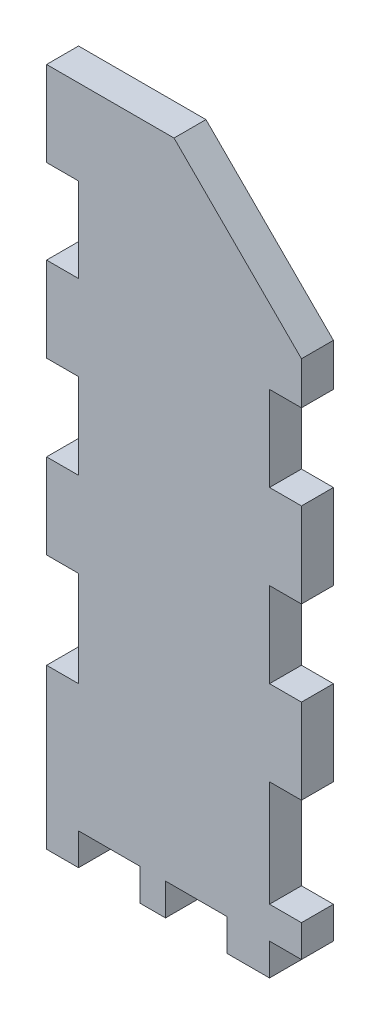
ISO-10303-21;
HEADER;
FILE_DESCRIPTION(('STEP AP214'),'2;1');
FILE_NAME('part.step','',(''),(''),'','','');
FILE_SCHEMA(('AUTOMOTIVE_DESIGN { 1 0 10303 214 1 1 1 1 }'));
ENDSEC;
DATA;
#1=APPLICATION_CONTEXT('core data for automotive mechanical design processes');
#2=APPLICATION_PROTOCOL_DEFINITION('international standard','automotive_design',2000,#1);
#3=PRODUCT_CONTEXT('',#1,'mechanical');
#4=PRODUCT('Part','Part','',(#3));
#5=PRODUCT_RELATED_PRODUCT_CATEGORY('part','',(#4));
#6=PRODUCT_DEFINITION_FORMATION('','',#4);
#7=PRODUCT_DEFINITION_CONTEXT('part definition',#1,'design');
#8=PRODUCT_DEFINITION('design','',#6,#7);
#9=PRODUCT_DEFINITION_SHAPE('','',#8);
#10=(LENGTH_UNIT() NAMED_UNIT(*) SI_UNIT(.MILLI.,.METRE.));
#11=(NAMED_UNIT(*) PLANE_ANGLE_UNIT() SI_UNIT($,.RADIAN.));
#12=(NAMED_UNIT(*) SI_UNIT($,.STERADIAN.) SOLID_ANGLE_UNIT());
#13=UNCERTAINTY_MEASURE_WITH_UNIT(LENGTH_MEASURE(1.E-05),#10,'distance_accuracy_value','');
#14=(GEOMETRIC_REPRESENTATION_CONTEXT(3) GLOBAL_UNCERTAINTY_ASSIGNED_CONTEXT((#13)) GLOBAL_UNIT_ASSIGNED_CONTEXT((#10,
#11,#12)) REPRESENTATION_CONTEXT('',''));
#15=CARTESIAN_POINT('',(0.,0.,0.));
#16=DIRECTION('',(0.,0.,1.));
#17=DIRECTION('',(1.,0.,0.));
#18=AXIS2_PLACEMENT_3D('',#15,#16,#17);
#19=CARTESIAN_POINT('',(38.1,0.,4.7752));
#20=DIRECTION('',(-1.,0.,0.));
#21=DIRECTION('',(0.,0.,1.));
#22=AXIS2_PLACEMENT_3D('',#19,#20,#21);
#23=PLANE('',#22);
#24=DIRECTION('',(0.,1.,0.));
#25=VECTOR('',#24,1.);
#26=CARTESIAN_POINT('',(38.1,0.,0.));
#27=LINE('',#26,#25);
#28=CARTESIAN_POINT('',(38.1,25.4,0.));
#29=VERTEX_POINT('',#28);
#30=CARTESIAN_POINT('',(38.1,38.1,0.));
#31=VERTEX_POINT('',#30);
#32=EDGE_CURVE('E566',#29,#31,#27,.T.);
#33=ORIENTED_EDGE('',*,*,#32,.T.);
#34=DIRECTION('',(0.,0.,1.));
#35=VECTOR('',#34,1.);
#36=CARTESIAN_POINT('',(38.1,38.1,-1.5748));
#37=LINE('',#36,#35);
#38=CARTESIAN_POINT('',(38.1,38.1,4.7752));
#39=VERTEX_POINT('',#38);
#40=EDGE_CURVE('E490',#31,#39,#37,.T.);
#41=ORIENTED_EDGE('',*,*,#40,.T.);
#42=DIRECTION('',(0.,1.,0.));
#43=VECTOR('',#42,1.);
#44=CARTESIAN_POINT('',(38.1,0.,4.7752));
#45=LINE('',#44,#43);
#46=CARTESIAN_POINT('',(38.1,25.4,4.7752));
#47=VERTEX_POINT('',#46);
#48=EDGE_CURVE('E330',#47,#39,#45,.T.);
#49=ORIENTED_EDGE('',*,*,#48,.F.);
#50=DIRECTION('',(0.,0.,1.));
#51=VECTOR('',#50,1.);
#52=CARTESIAN_POINT('',(38.1,25.4,-1.5748));
#53=LINE('',#52,#51);
#54=EDGE_CURVE('E309',#29,#47,#53,.T.);
#55=ORIENTED_EDGE('',*,*,#54,.F.);
#56=EDGE_LOOP('',(#33,#41,#49,#55));
#57=FACE_BOUND('',#56,.T.);
#58=ADVANCED_FACE('F45',(#57),#23,.F.);
#59=CARTESIAN_POINT('',(38.1,4.7752,0.));
#60=VERTEX_POINT('',#59);
#61=CARTESIAN_POINT('',(38.1,9.5504,0.));
#62=VERTEX_POINT('',#61);
#63=EDGE_CURVE('E318',#60,#62,#27,.T.);
#64=ORIENTED_EDGE('',*,*,#63,.T.);
#65=DIRECTION('',(0.,0.,1.));
#66=VECTOR('',#65,1.);
#67=CARTESIAN_POINT('',(38.1,9.5504,-1.5748));
#68=LINE('',#67,#66);
#69=CARTESIAN_POINT('',(38.1,9.5504,4.7752));
#70=VERTEX_POINT('',#69);
#71=EDGE_CURVE('E299',#62,#70,#68,.T.);
#72=ORIENTED_EDGE('',*,*,#71,.T.);
#73=CARTESIAN_POINT('',(38.1,4.7752,4.7752));
#74=VERTEX_POINT('',#73);
#75=EDGE_CURVE('E316',#74,#70,#45,.T.);
#76=ORIENTED_EDGE('',*,*,#75,.F.);
#77=DIRECTION('',(0.,0.,1.));
#78=VECTOR('',#77,1.);
#79=CARTESIAN_POINT('',(38.1,4.7752,-1.5748));
#80=LINE('',#79,#78);
#81=EDGE_CURVE('E368',#60,#74,#80,.T.);
#82=ORIENTED_EDGE('',*,*,#81,.F.);
#83=EDGE_LOOP('',(#64,#72,#76,#82));
#84=FACE_BOUND('',#83,.T.);
#85=ADVANCED_FACE('F314',(#84),#23,.F.);
#86=CARTESIAN_POINT('',(38.1,50.8,4.7752));
#87=VERTEX_POINT('',#86);
#88=CARTESIAN_POINT('',(38.1,63.5,4.7752));
#89=VERTEX_POINT('',#88);
#90=EDGE_CURVE('E340',#87,#89,#45,.T.);
#91=ORIENTED_EDGE('',*,*,#90,.F.);
#92=DIRECTION('',(0.,0.,1.));
#93=VECTOR('',#92,1.);
#94=CARTESIAN_POINT('',(38.1,50.8,-1.5748));
#95=LINE('',#94,#93);
#96=CARTESIAN_POINT('',(38.1,50.8,0.));
#97=VERTEX_POINT('',#96);
#98=EDGE_CURVE('E514',#97,#87,#95,.T.);
#99=ORIENTED_EDGE('',*,*,#98,.F.);
#100=CARTESIAN_POINT('',(38.1,63.5,0.));
#101=VERTEX_POINT('',#100);
#102=EDGE_CURVE('E780',#97,#101,#27,.T.);
#103=ORIENTED_EDGE('',*,*,#102,.T.);
#104=DIRECTION('',(0.,0.,1.));
#105=VECTOR('',#104,1.);
#106=CARTESIAN_POINT('',(38.1,63.5,-1.5748));
#107=LINE('',#106,#105);
#108=EDGE_CURVE('E472',#101,#89,#107,.T.);
#109=ORIENTED_EDGE('',*,*,#108,.T.);
#110=EDGE_LOOP('',(#91,#99,#103,#109));
#111=FACE_BOUND('',#110,.T.);
#112=ADVANCED_FACE('F753',(#111),#23,.F.);
#113=CARTESIAN_POINT('',(0.,0.,4.7752));
#114=DIRECTION('',(-1.,0.,0.));
#115=DIRECTION('',(0.,0.,1.));
#116=AXIS2_PLACEMENT_3D('',#113,#114,#115);
#117=PLANE('',#116);
#118=DIRECTION('',(0.,0.,-1.));
#119=VECTOR('',#118,1.);
#120=CARTESIAN_POINT('',(0.,88.9,4.7752));
#121=LINE('',#120,#119);
#122=CARTESIAN_POINT('',(0.,88.9,4.7752));
#123=VERTEX_POINT('',#122);
#124=CARTESIAN_POINT('',(0.,88.9,0.));
#125=VERTEX_POINT('',#124);
#126=EDGE_CURVE('E612',#123,#125,#121,.T.);
#127=ORIENTED_EDGE('',*,*,#126,.F.);
#128=DIRECTION('',(0.,1.,0.));
#129=VECTOR('',#128,1.);
#130=CARTESIAN_POINT('',(0.,0.,4.7752));
#131=LINE('',#130,#129);
#132=CARTESIAN_POINT('',(0.,101.6,4.7752));
#133=VERTEX_POINT('',#132);
#134=EDGE_CURVE('E694',#123,#133,#131,.T.);
#135=ORIENTED_EDGE('',*,*,#134,.T.);
#136=DIRECTION('',(0.,0.,-1.));
#137=VECTOR('',#136,1.);
#138=CARTESIAN_POINT('',(0.,101.6,4.7752));
#139=LINE('',#138,#137);
#140=CARTESIAN_POINT('',(0.,101.6,0.));
#141=VERTEX_POINT('',#140);
#142=EDGE_CURVE('E656',#133,#141,#139,.T.);
#143=ORIENTED_EDGE('',*,*,#142,.T.);
#144=DIRECTION('',(0.,1.,0.));
#145=VECTOR('',#144,1.);
#146=CARTESIAN_POINT('',(0.,0.,0.));
#147=LINE('',#146,#145);
#148=EDGE_CURVE('E674',#125,#141,#147,.T.);
#149=ORIENTED_EDGE('',*,*,#148,.F.);
#150=EDGE_LOOP('',(#127,#135,#143,#149));
#151=FACE_BOUND('',#150,.T.);
#152=ADVANCED_FACE('F763',(#151),#117,.T.);
#153=DIRECTION('',(0.,0.,-1.));
#154=VECTOR('',#153,1.);
#155=CARTESIAN_POINT('',(0.,38.1,4.7752));
#156=LINE('',#155,#154);
#157=CARTESIAN_POINT('',(0.,38.1,4.7752));
#158=VERTEX_POINT('',#157);
#159=CARTESIAN_POINT('',(0.,38.1,0.));
#160=VERTEX_POINT('',#159);
#161=EDGE_CURVE('E618',#158,#160,#156,.T.);
#162=ORIENTED_EDGE('',*,*,#161,.F.);
#163=CARTESIAN_POINT('',(0.,50.8,4.7752));
#164=VERTEX_POINT('',#163);
#165=EDGE_CURVE('E693',#158,#164,#131,.T.);
#166=ORIENTED_EDGE('',*,*,#165,.T.);
#167=DIRECTION('',(0.,0.,1.));
#168=VECTOR('',#167,1.);
#169=CARTESIAN_POINT('',(0.,50.8,4.7752));
#170=LINE('',#169,#168);
#171=CARTESIAN_POINT('',(0.,50.8,0.));
#172=VERTEX_POINT('',#171);
#173=EDGE_CURVE('E627',#172,#164,#170,.T.);
#174=ORIENTED_EDGE('',*,*,#173,.F.);
#175=EDGE_CURVE('E673',#160,#172,#147,.T.);
#176=ORIENTED_EDGE('',*,*,#175,.F.);
#177=EDGE_LOOP('',(#162,#166,#174,#176));
#178=FACE_BOUND('',#177,.T.);
#179=ADVANCED_FACE('F768',(#178),#117,.T.);
#180=DIRECTION('',(0.,0.,1.));
#181=VECTOR('',#180,1.);
#182=CARTESIAN_POINT('',(0.,76.2749723350131,4.7752));
#183=LINE('',#182,#181);
#184=CARTESIAN_POINT('',(0.,76.2749723350131,0.));
#185=VERTEX_POINT('',#184);
#186=CARTESIAN_POINT('',(0.,76.2749723350131,4.7752));
#187=VERTEX_POINT('',#186);
#188=EDGE_CURVE('E615',#185,#187,#183,.T.);
#189=ORIENTED_EDGE('',*,*,#188,.F.);
#190=CARTESIAN_POINT('',(0.,63.5749723350131,0.));
#191=VERTEX_POINT('',#190);
#192=EDGE_CURVE('E830',#191,#185,#147,.T.);
#193=ORIENTED_EDGE('',*,*,#192,.F.);
#194=DIRECTION('',(0.,0.,-1.));
#195=VECTOR('',#194,1.);
#196=CARTESIAN_POINT('',(0.,63.5749723350131,4.7752));
#197=LINE('',#196,#195);
#198=CARTESIAN_POINT('',(0.,63.5749723350131,4.7752));
#199=VERTEX_POINT('',#198);
#200=EDGE_CURVE('E624',#199,#191,#197,.T.);
#201=ORIENTED_EDGE('',*,*,#200,.F.);
#202=EDGE_CURVE('E701',#199,#187,#131,.T.);
#203=ORIENTED_EDGE('',*,*,#202,.T.);
#204=EDGE_LOOP('',(#189,#193,#201,#203));
#205=FACE_BOUND('',#204,.T.);
#206=ADVANCED_FACE('F811',(#205),#117,.T.);
#207=CARTESIAN_POINT('',(0.,0.,4.7752));
#208=DIRECTION('',(0.,1.,0.));
#209=DIRECTION('',(0.,0.,1.));
#210=AXIS2_PLACEMENT_3D('',#207,#208,#209);
#211=PLANE('',#210);
#212=DIRECTION('',(0.,0.,1.));
#213=VECTOR('',#212,1.);
#214=CARTESIAN_POINT('',(4.7752,0.,-1.5748));
#215=LINE('',#214,#213);
#216=CARTESIAN_POINT('',(4.7752,0.,0.));
#217=VERTEX_POINT('',#216);
#218=CARTESIAN_POINT('',(4.7752,0.,4.7752));
#219=VERTEX_POINT('',#218);
#220=EDGE_CURVE('E405',#217,#219,#215,.T.);
#221=ORIENTED_EDGE('',*,*,#220,.T.);
#222=DIRECTION('',(1.,0.,0.));
#223=VECTOR('',#222,1.);
#224=CARTESIAN_POINT('',(0.,0.,4.7752));
#225=LINE('',#224,#223);
#226=CARTESIAN_POINT('',(0.,0.,4.7752));
#227=VERTEX_POINT('',#226);
#228=EDGE_CURVE('E338',#227,#219,#225,.T.);
#229=ORIENTED_EDGE('',*,*,#228,.F.);
#230=DIRECTION('',(0.,0.,-1.));
#231=VECTOR('',#230,1.);
#232=CARTESIAN_POINT('',(0.,0.,4.7752));
#233=LINE('',#232,#231);
#234=CARTESIAN_POINT('',(0.,0.,0.));
#235=VERTEX_POINT('',#234);
#236=EDGE_CURVE('E664',#227,#235,#233,.T.);
#237=ORIENTED_EDGE('',*,*,#236,.T.);
#238=DIRECTION('',(1.,0.,0.));
#239=VECTOR('',#238,1.);
#240=CARTESIAN_POINT('',(0.,0.,0.));
#241=LINE('',#240,#239);
#242=EDGE_CURVE('E675',#235,#217,#241,.T.);
#243=ORIENTED_EDGE('',*,*,#242,.T.);
#244=EDGE_LOOP('',(#221,#229,#237,#243));
#245=FACE_BOUND('',#244,.T.);
#246=ADVANCED_FACE('F761',(#245),#211,.F.);
#247=CARTESIAN_POINT('',(13.97,0.,4.7752));
#248=VERTEX_POINT('',#247);
#249=CARTESIAN_POINT('',(17.78,0.,4.7752));
#250=VERTEX_POINT('',#249);
#251=EDGE_CURVE('E336',#248,#250,#225,.T.);
#252=ORIENTED_EDGE('',*,*,#251,.F.);
#253=DIRECTION('',(0.,0.,1.));
#254=VECTOR('',#253,1.);
#255=CARTESIAN_POINT('',(13.97,0.,-1.5748));
#256=LINE('',#255,#254);
#257=CARTESIAN_POINT('',(13.97,0.,0.));
#258=VERTEX_POINT('',#257);
#259=EDGE_CURVE('E410',#258,#248,#256,.T.);
#260=ORIENTED_EDGE('',*,*,#259,.F.);
#261=CARTESIAN_POINT('',(17.78,0.,0.));
#262=VERTEX_POINT('',#261);
#263=EDGE_CURVE('E679',#258,#262,#241,.T.);
#264=ORIENTED_EDGE('',*,*,#263,.T.);
#265=DIRECTION('',(0.,0.,1.));
#266=VECTOR('',#265,1.);
#267=CARTESIAN_POINT('',(17.78,0.,-1.5748));
#268=LINE('',#267,#266);
#269=EDGE_CURVE('E380',#262,#250,#268,.T.);
#270=ORIENTED_EDGE('',*,*,#269,.T.);
#271=EDGE_LOOP('',(#252,#260,#264,#270));
#272=FACE_BOUND('',#271,.T.);
#273=ADVANCED_FACE('F707',(#272),#211,.F.);
#274=CARTESIAN_POINT('',(26.9748,0.,4.7752));
#275=VERTEX_POINT('',#274);
#276=CARTESIAN_POINT('',(33.3248,0.,4.7752));
#277=VERTEX_POINT('',#276);
#278=EDGE_CURVE('E329',#275,#277,#225,.T.);
#279=ORIENTED_EDGE('',*,*,#278,.F.);
#280=DIRECTION('',(0.,0.,1.));
#281=VECTOR('',#280,1.);
#282=CARTESIAN_POINT('',(26.9748,0.,-1.5748));
#283=LINE('',#282,#281);
#284=CARTESIAN_POINT('',(26.9748,0.,0.));
#285=VERTEX_POINT('',#284);
#286=EDGE_CURVE('E385',#285,#275,#283,.T.);
#287=ORIENTED_EDGE('',*,*,#286,.F.);
#288=CARTESIAN_POINT('',(33.3248,0.,0.));
#289=VERTEX_POINT('',#288);
#290=EDGE_CURVE('E680',#285,#289,#241,.T.);
#291=ORIENTED_EDGE('',*,*,#290,.T.);
#292=DIRECTION('',(0.,0.,1.));
#293=VECTOR('',#292,1.);
#294=CARTESIAN_POINT('',(33.3248,0.,-1.5748));
#295=LINE('',#294,#293);
#296=EDGE_CURVE('E363',#289,#277,#295,.T.);
#297=ORIENTED_EDGE('',*,*,#296,.T.);
#298=EDGE_LOOP('',(#279,#287,#291,#297));
#299=FACE_BOUND('',#298,.T.);
#300=ADVANCED_FACE('F726',(#299),#211,.F.);
#301=CARTESIAN_POINT('',(38.1,76.2,4.7752));
#302=VERTEX_POINT('',#301);
#303=CARTESIAN_POINT('',(38.1,82.55,4.7752));
#304=VERTEX_POINT('',#303);
#305=EDGE_CURVE('E332',#302,#304,#45,.T.);
#306=ORIENTED_EDGE('',*,*,#305,.F.);
#307=DIRECTION('',(0.,0.,1.));
#308=VECTOR('',#307,1.);
#309=CARTESIAN_POINT('',(38.1,76.2,-1.5748));
#310=LINE('',#309,#308);
#311=CARTESIAN_POINT('',(38.1,76.2,0.));
#312=VERTEX_POINT('',#311);
#313=EDGE_CURVE('E535',#312,#302,#310,.T.);
#314=ORIENTED_EDGE('',*,*,#313,.F.);
#315=CARTESIAN_POINT('',(38.1,82.55,0.));
#316=VERTEX_POINT('',#315);
#317=EDGE_CURVE('E683',#312,#316,#27,.T.);
#318=ORIENTED_EDGE('',*,*,#317,.T.);
#319=DIRECTION('',(0.,0.,-1.));
#320=VECTOR('',#319,1.);
#321=CARTESIAN_POINT('',(38.1,82.55,4.7752));
#322=LINE('',#321,#320);
#323=EDGE_CURVE('E660',#304,#316,#322,.T.);
#324=ORIENTED_EDGE('',*,*,#323,.F.);
#325=EDGE_LOOP('',(#306,#314,#318,#324));
#326=FACE_BOUND('',#325,.T.);
#327=ADVANCED_FACE('F748',(#326),#23,.F.);
#328=CARTESIAN_POINT('',(0.,0.,4.7752));
#329=DIRECTION('',(0.,0.,1.));
#330=DIRECTION('',(1.,0.,0.));
#331=AXIS2_PLACEMENT_3D('',#328,#329,#330);
#332=PLANE('',#331);
#333=DIRECTION('',(-1.,0.,0.));
#334=VECTOR('',#333,1.);
#335=CARTESIAN_POINT('',(0.,88.9,4.7752));
#336=LINE('',#335,#334);
#337=CARTESIAN_POINT('',(4.7752,88.9,4.7752));
#338=VERTEX_POINT('',#337);
#339=EDGE_CURVE('E477',#338,#123,#336,.T.);
#340=ORIENTED_EDGE('',*,*,#339,.F.);
#341=DIRECTION('',(0.,1.,0.));
#342=VECTOR('',#341,1.);
#343=CARTESIAN_POINT('',(4.7752,76.2749723350131,4.7752));
#344=LINE('',#343,#342);
#345=CARTESIAN_POINT('',(4.7752,76.2749723350131,4.7752));
#346=VERTEX_POINT('',#345);
#347=EDGE_CURVE('E473',#346,#338,#344,.T.);
#348=ORIENTED_EDGE('',*,*,#347,.F.);
#349=DIRECTION('',(1.,0.,0.));
#350=VECTOR('',#349,1.);
#351=CARTESIAN_POINT('',(0.,76.2749723350131,4.7752));
#352=LINE('',#351,#350);
#353=EDGE_CURVE('E468',#187,#346,#352,.T.);
#354=ORIENTED_EDGE('',*,*,#353,.F.);
#355=ORIENTED_EDGE('',*,*,#202,.F.);
#356=DIRECTION('',(-1.,0.,0.));
#357=VECTOR('',#356,1.);
#358=CARTESIAN_POINT('',(0.,63.5749723350131,4.7752));
#359=LINE('',#358,#357);
#360=CARTESIAN_POINT('',(4.7752,63.5749723350131,4.7752));
#361=VERTEX_POINT('',#360);
#362=EDGE_CURVE('E454',#361,#199,#359,.T.);
#363=ORIENTED_EDGE('',*,*,#362,.F.);
#364=DIRECTION('',(0.,1.,0.));
#365=VECTOR('',#364,1.);
#366=CARTESIAN_POINT('',(4.7752,50.8,4.7752));
#367=LINE('',#366,#365);
#368=CARTESIAN_POINT('',(4.7752,50.8,4.7752));
#369=VERTEX_POINT('',#368);
#370=EDGE_CURVE('E459',#369,#361,#367,.T.);
#371=ORIENTED_EDGE('',*,*,#370,.F.);
#372=DIRECTION('',(1.,0.,0.));
#373=VECTOR('',#372,1.);
#374=CARTESIAN_POINT('',(0.,50.8,4.7752));
#375=LINE('',#374,#373);
#376=EDGE_CURVE('E463',#164,#369,#375,.T.);
#377=ORIENTED_EDGE('',*,*,#376,.F.);
#378=ORIENTED_EDGE('',*,*,#165,.F.);
#379=DIRECTION('',(-1.,0.,0.));
#380=VECTOR('',#379,1.);
#381=CARTESIAN_POINT('',(0.,38.1,4.7752));
#382=LINE('',#381,#380);
#383=CARTESIAN_POINT('',(4.7752,38.1,4.7752));
#384=VERTEX_POINT('',#383);
#385=EDGE_CURVE('E495',#384,#158,#382,.T.);
#386=ORIENTED_EDGE('',*,*,#385,.F.);
#387=DIRECTION('',(0.,1.,0.));
#388=VECTOR('',#387,1.);
#389=CARTESIAN_POINT('',(4.7752,38.1,4.7752));
#390=LINE('',#389,#388);
#391=CARTESIAN_POINT('',(4.7752,23.8252,4.7752));
#392=VERTEX_POINT('',#391);
#393=EDGE_CURVE('E491',#392,#384,#390,.T.);
#394=ORIENTED_EDGE('',*,*,#393,.F.);
#395=DIRECTION('',(1.,0.,0.));
#396=VECTOR('',#395,1.);
#397=CARTESIAN_POINT('',(0.,23.8252,4.7752));
#398=LINE('',#397,#396);
#399=CARTESIAN_POINT('',(0.,23.8252,4.7752));
#400=VERTEX_POINT('',#399);
#401=EDGE_CURVE('E486',#400,#392,#398,.T.);
#402=ORIENTED_EDGE('',*,*,#401,.F.);
#403=EDGE_CURVE('E661',#227,#400,#131,.T.);
#404=ORIENTED_EDGE('',*,*,#403,.F.);
#405=ORIENTED_EDGE('',*,*,#228,.T.);
#406=DIRECTION('',(0.,1.,0.));
#407=VECTOR('',#406,1.);
#408=CARTESIAN_POINT('',(4.7752,0.,4.7752));
#409=LINE('',#408,#407);
#410=CARTESIAN_POINT('',(4.7752,4.7752,4.7752));
#411=VERTEX_POINT('',#410);
#412=EDGE_CURVE('E420',#219,#411,#409,.T.);
#413=ORIENTED_EDGE('',*,*,#412,.T.);
#414=DIRECTION('',(1.,0.,0.));
#415=VECTOR('',#414,1.);
#416=CARTESIAN_POINT('',(0.,4.7752,4.7752));
#417=LINE('',#416,#415);
#418=CARTESIAN_POINT('',(13.97,4.7752,4.7752));
#419=VERTEX_POINT('',#418);
#420=EDGE_CURVE('E391',#411,#419,#417,.T.);
#421=ORIENTED_EDGE('',*,*,#420,.T.);
#422=DIRECTION('',(0.,1.,0.));
#423=VECTOR('',#422,1.);
#424=CARTESIAN_POINT('',(13.97,0.,4.7752));
#425=LINE('',#424,#423);
#426=EDGE_CURVE('E406',#248,#419,#425,.T.);
#427=ORIENTED_EDGE('',*,*,#426,.F.);
#428=ORIENTED_EDGE('',*,*,#251,.T.);
#429=DIRECTION('',(0.,1.,0.));
#430=VECTOR('',#429,1.);
#431=CARTESIAN_POINT('',(17.78,0.,4.7752));
#432=LINE('',#431,#430);
#433=CARTESIAN_POINT('',(17.78,4.7752,4.7752));
#434=VERTEX_POINT('',#433);
#435=EDGE_CURVE('E395',#250,#434,#432,.T.);
#436=ORIENTED_EDGE('',*,*,#435,.T.);
#437=DIRECTION('',(1.,0.,0.));
#438=VECTOR('',#437,1.);
#439=CARTESIAN_POINT('',(0.,4.7752,4.7752));
#440=LINE('',#439,#438);
#441=CARTESIAN_POINT('',(26.9748,4.7752,4.7752));
#442=VERTEX_POINT('',#441);
#443=EDGE_CURVE('E371',#434,#442,#440,.T.);
#444=ORIENTED_EDGE('',*,*,#443,.T.);
#445=DIRECTION('',(0.,1.,0.));
#446=VECTOR('',#445,1.);
#447=CARTESIAN_POINT('',(26.9748,0.,4.7752));
#448=LINE('',#447,#446);
#449=EDGE_CURVE('E381',#275,#442,#448,.T.);
#450=ORIENTED_EDGE('',*,*,#449,.F.);
#451=ORIENTED_EDGE('',*,*,#278,.T.);
#452=DIRECTION('',(0.,1.,0.));
#453=VECTOR('',#452,1.);
#454=CARTESIAN_POINT('',(33.3248,0.,4.7752));
#455=LINE('',#454,#453);
#456=CARTESIAN_POINT('',(33.3248,4.7752,4.7752));
#457=VERTEX_POINT('',#456);
#458=EDGE_CURVE('E364',#277,#457,#455,.T.);
#459=ORIENTED_EDGE('',*,*,#458,.T.);
#460=DIRECTION('',(1.,0.,0.));
#461=VECTOR('',#460,1.);
#462=CARTESIAN_POINT('',(0.,4.7752,4.7752));
#463=LINE('',#462,#461);
#464=EDGE_CURVE('E327',#457,#74,#463,.T.);
#465=ORIENTED_EDGE('',*,*,#464,.T.);
#466=ORIENTED_EDGE('',*,*,#75,.T.);
#467=DIRECTION('',(1.,0.,0.));
#468=VECTOR('',#467,1.);
#469=CARTESIAN_POINT('',(38.1,9.5504,4.7752));
#470=LINE('',#469,#468);
#471=CARTESIAN_POINT('',(33.3248,9.5504,4.7752));
#472=VERTEX_POINT('',#471);
#473=EDGE_CURVE('E296',#472,#70,#470,.T.);
#474=ORIENTED_EDGE('',*,*,#473,.F.);
#475=DIRECTION('',(0.,-1.,0.));
#476=VECTOR('',#475,1.);
#477=CARTESIAN_POINT('',(33.3248,25.4,4.7752));
#478=LINE('',#477,#476);
#479=CARTESIAN_POINT('',(33.3248,25.4,4.7752));
#480=VERTEX_POINT('',#479);
#481=EDGE_CURVE('E308',#480,#472,#478,.T.);
#482=ORIENTED_EDGE('',*,*,#481,.F.);
#483=DIRECTION('',(-1.,0.,0.));
#484=VECTOR('',#483,1.);
#485=CARTESIAN_POINT('',(38.1,25.4,4.7752));
#486=LINE('',#485,#484);
#487=EDGE_CURVE('E502',#47,#480,#486,.T.);
#488=ORIENTED_EDGE('',*,*,#487,.F.);
#489=ORIENTED_EDGE('',*,*,#48,.T.);
#490=DIRECTION('',(1.,0.,0.));
#491=VECTOR('',#490,1.);
#492=CARTESIAN_POINT('',(38.1,38.1,4.7752));
#493=LINE('',#492,#491);
#494=CARTESIAN_POINT('',(33.3248,38.1,4.7752));
#495=VERTEX_POINT('',#494);
#496=EDGE_CURVE('E511',#495,#39,#493,.T.);
#497=ORIENTED_EDGE('',*,*,#496,.F.);
#498=DIRECTION('',(0.,-1.,0.));
#499=VECTOR('',#498,1.);
#500=CARTESIAN_POINT('',(33.3248,50.8,4.7752));
#501=LINE('',#500,#499);
#502=CARTESIAN_POINT('',(33.3248,50.8,4.7752));
#503=VERTEX_POINT('',#502);
#504=EDGE_CURVE('E507',#503,#495,#501,.T.);
#505=ORIENTED_EDGE('',*,*,#504,.F.);
#506=DIRECTION('',(-1.,0.,0.));
#507=VECTOR('',#506,1.);
#508=CARTESIAN_POINT('',(38.1,50.8,4.7752));
#509=LINE('',#508,#507);
#510=EDGE_CURVE('E467',#87,#503,#509,.T.);
#511=ORIENTED_EDGE('',*,*,#510,.F.);
#512=ORIENTED_EDGE('',*,*,#90,.T.);
#513=DIRECTION('',(1.,0.,0.));
#514=VECTOR('',#513,1.);
#515=CARTESIAN_POINT('',(38.1,63.5,4.7752));
#516=LINE('',#515,#514);
#517=CARTESIAN_POINT('',(33.3248,63.5,4.7752));
#518=VERTEX_POINT('',#517);
#519=EDGE_CURVE('E532',#518,#89,#516,.T.);
#520=ORIENTED_EDGE('',*,*,#519,.F.);
#521=DIRECTION('',(0.,-1.,0.));
#522=VECTOR('',#521,1.);
#523=CARTESIAN_POINT('',(33.3248,63.5,4.7752));
#524=LINE('',#523,#522);
#525=CARTESIAN_POINT('',(33.3248,76.2,4.7752));
#526=VERTEX_POINT('',#525);
#527=EDGE_CURVE('E528',#526,#518,#524,.T.);
#528=ORIENTED_EDGE('',*,*,#527,.F.);
#529=DIRECTION('',(-1.,0.,0.));
#530=VECTOR('',#529,1.);
#531=CARTESIAN_POINT('',(38.1,76.2,4.7752));
#532=LINE('',#531,#530);
#533=EDGE_CURVE('E320',#302,#526,#532,.T.);
#534=ORIENTED_EDGE('',*,*,#533,.F.);
#535=ORIENTED_EDGE('',*,*,#305,.T.);
#536=DIRECTION('',(0.707106781186548,-0.707106781186547,0.));
#537=VECTOR('',#536,1.);
#538=CARTESIAN_POINT('',(19.05,101.6,4.7752));
#539=LINE('',#538,#537);
#540=CARTESIAN_POINT('',(19.05,101.6,4.7752));
#541=VERTEX_POINT('',#540);
#542=EDGE_CURVE('E343',#541,#304,#539,.T.);
#543=ORIENTED_EDGE('',*,*,#542,.F.);
#544=DIRECTION('',(1.,0.,0.));
#545=VECTOR('',#544,1.);
#546=CARTESIAN_POINT('',(0.,101.6,4.7752));
#547=LINE('',#546,#545);
#548=EDGE_CURVE('E352',#133,#541,#547,.T.);
#549=ORIENTED_EDGE('',*,*,#548,.F.);
#550=ORIENTED_EDGE('',*,*,#134,.F.);
#551=EDGE_LOOP('',(#340,#348,#354,#355,#363,#371,#377,#378,#386,#394,#402,#404,#405,#413,#421,
#427,#428,#436,#444,#450,#451,#459,#465,#466,#474,#482,#488,#489,#497,#505,#511,#512,#520,#528,
#534,#535,#543,#549,#550));
#552=FACE_BOUND('',#551,.T.);
#553=ADVANCED_FACE('F324',(#552),#332,.T.);
#554=CARTESIAN_POINT('',(0.,0.,0.));
#555=DIRECTION('',(0.,0.,1.));
#556=DIRECTION('',(1.,0.,0.));
#557=AXIS2_PLACEMENT_3D('',#554,#555,#556);
#558=PLANE('',#557);
#559=DIRECTION('',(0.,1.,0.));
#560=VECTOR('',#559,1.);
#561=CARTESIAN_POINT('',(4.7752,0.,0.));
#562=LINE('',#561,#560);
#563=CARTESIAN_POINT('',(4.7752,76.2749723350131,0.));
#564=VERTEX_POINT('',#563);
#565=CARTESIAN_POINT('',(4.7752,88.9,0.));
#566=VERTEX_POINT('',#565);
#567=EDGE_CURVE('E11',#564,#566,#562,.T.);
#568=ORIENTED_EDGE('',*,*,#567,.T.);
#569=DIRECTION('',(-1.,0.,0.));
#570=VECTOR('',#569,1.);
#571=CARTESIAN_POINT('',(0.,88.9,0.));
#572=LINE('',#571,#570);
#573=EDGE_CURVE('E376',#566,#125,#572,.T.);
#574=ORIENTED_EDGE('',*,*,#573,.T.);
#575=ORIENTED_EDGE('',*,*,#148,.T.);
#576=DIRECTION('',(1.,0.,0.));
#577=VECTOR('',#576,1.);
#578=CARTESIAN_POINT('',(0.,101.6,0.));
#579=LINE('',#578,#577);
#580=CARTESIAN_POINT('',(19.05,101.6,0.));
#581=VERTEX_POINT('',#580);
#582=EDGE_CURVE('E416',#141,#581,#579,.T.);
#583=ORIENTED_EDGE('',*,*,#582,.T.);
#584=DIRECTION('',(0.707106781186548,-0.707106781186547,0.));
#585=VECTOR('',#584,1.);
#586=CARTESIAN_POINT('',(19.05,101.6,0.));
#587=LINE('',#586,#585);
#588=EDGE_CURVE('E684',#581,#316,#587,.T.);
#589=ORIENTED_EDGE('',*,*,#588,.T.);
#590=ORIENTED_EDGE('',*,*,#317,.F.);
#591=DIRECTION('',(-1.,0.,0.));
#592=VECTOR('',#591,1.);
#593=CARTESIAN_POINT('',(-2.21454060762996E-13,76.1999999999999,0.));
#594=LINE('',#593,#592);
#595=CARTESIAN_POINT('',(33.3248,76.2,0.));
#596=VERTEX_POINT('',#595);
#597=EDGE_CURVE('E604',#312,#596,#594,.T.);
#598=ORIENTED_EDGE('',*,*,#597,.T.);
#599=DIRECTION('',(0.,-1.,0.));
#600=VECTOR('',#599,1.);
#601=CARTESIAN_POINT('',(33.3248,0.,0.));
#602=LINE('',#601,#600);
#603=CARTESIAN_POINT('',(33.3248,63.5,0.));
#604=VERTEX_POINT('',#603);
#605=EDGE_CURVE('E600',#596,#604,#602,.T.);
#606=ORIENTED_EDGE('',*,*,#605,.T.);
#607=DIRECTION('',(1.,0.,0.));
#608=VECTOR('',#607,1.);
#609=CARTESIAN_POINT('',(0.,63.5,0.));
#610=LINE('',#609,#608);
#611=EDGE_CURVE('E596',#604,#101,#610,.T.);
#612=ORIENTED_EDGE('',*,*,#611,.T.);
#613=ORIENTED_EDGE('',*,*,#102,.F.);
#614=DIRECTION('',(-1.,0.,0.));
#615=VECTOR('',#614,1.);
#616=CARTESIAN_POINT('',(0.,50.8,0.));
#617=LINE('',#616,#615);
#618=CARTESIAN_POINT('',(33.3248,50.8,0.));
#619=VERTEX_POINT('',#618);
#620=EDGE_CURVE('E578',#97,#619,#617,.T.);
#621=ORIENTED_EDGE('',*,*,#620,.T.);
#622=DIRECTION('',(0.,-1.,0.));
#623=VECTOR('',#622,1.);
#624=CARTESIAN_POINT('',(33.3248,0.,0.));
#625=LINE('',#624,#623);
#626=CARTESIAN_POINT('',(33.3248,38.1,0.));
#627=VERTEX_POINT('',#626);
#628=EDGE_CURVE('E575',#619,#627,#625,.T.);
#629=ORIENTED_EDGE('',*,*,#628,.T.);
#630=DIRECTION('',(1.,0.,0.));
#631=VECTOR('',#630,1.);
#632=CARTESIAN_POINT('',(0.,38.1,0.));
#633=LINE('',#632,#631);
#634=EDGE_CURVE('E54',#627,#31,#633,.T.);
#635=ORIENTED_EDGE('',*,*,#634,.T.);
#636=ORIENTED_EDGE('',*,*,#32,.F.);
#637=DIRECTION('',(-1.,0.,0.));
#638=VECTOR('',#637,1.);
#639=CARTESIAN_POINT('',(0.,25.4,0.));
#640=LINE('',#639,#638);
#641=CARTESIAN_POINT('',(33.3248,25.4,0.));
#642=VERTEX_POINT('',#641);
#643=EDGE_CURVE('E560',#29,#642,#640,.T.);
#644=ORIENTED_EDGE('',*,*,#643,.T.);
#645=DIRECTION('',(0.,-1.,0.));
#646=VECTOR('',#645,1.);
#647=CARTESIAN_POINT('',(33.3248,0.,0.));
#648=LINE('',#647,#646);
#649=CARTESIAN_POINT('',(33.3248,9.5504,0.));
#650=VERTEX_POINT('',#649);
#651=EDGE_CURVE('E590',#642,#650,#648,.T.);
#652=ORIENTED_EDGE('',*,*,#651,.T.);
#653=DIRECTION('',(1.,0.,0.));
#654=VECTOR('',#653,1.);
#655=CARTESIAN_POINT('',(0.,9.5504,0.));
#656=LINE('',#655,#654);
#657=EDGE_CURVE('E587',#650,#62,#656,.T.);
#658=ORIENTED_EDGE('',*,*,#657,.T.);
#659=ORIENTED_EDGE('',*,*,#63,.F.);
#660=DIRECTION('',(1.,0.,0.));
#661=VECTOR('',#660,1.);
#662=CARTESIAN_POINT('',(0.,4.7752,0.));
#663=LINE('',#662,#661);
#664=CARTESIAN_POINT('',(33.3248,4.7752,0.));
#665=VERTEX_POINT('',#664);
#666=EDGE_CURVE('E650',#665,#60,#663,.T.);
#667=ORIENTED_EDGE('',*,*,#666,.F.);
#668=DIRECTION('',(0.,1.,0.));
#669=VECTOR('',#668,1.);
#670=CARTESIAN_POINT('',(33.3248,0.,0.));
#671=LINE('',#670,#669);
#672=EDGE_CURVE('E653',#289,#665,#671,.T.);
#673=ORIENTED_EDGE('',*,*,#672,.F.);
#674=ORIENTED_EDGE('',*,*,#290,.F.);
#675=DIRECTION('',(0.,1.,0.));
#676=VECTOR('',#675,1.);
#677=CARTESIAN_POINT('',(26.9748,0.,0.));
#678=LINE('',#677,#676);
#679=CARTESIAN_POINT('',(26.9748,4.7752,0.));
#680=VERTEX_POINT('',#679);
#681=EDGE_CURVE('E640',#285,#680,#678,.T.);
#682=ORIENTED_EDGE('',*,*,#681,.T.);
#683=DIRECTION('',(1.,0.,0.));
#684=VECTOR('',#683,1.);
#685=CARTESIAN_POINT('',(0.,4.7752,0.));
#686=LINE('',#685,#684);
#687=CARTESIAN_POINT('',(17.78,4.7752,0.));
#688=VERTEX_POINT('',#687);
#689=EDGE_CURVE('E644',#688,#680,#686,.T.);
#690=ORIENTED_EDGE('',*,*,#689,.F.);
#691=DIRECTION('',(0.,1.,0.));
#692=VECTOR('',#691,1.);
#693=CARTESIAN_POINT('',(17.78,0.,0.));
#694=LINE('',#693,#692);
#695=EDGE_CURVE('E647',#262,#688,#694,.T.);
#696=ORIENTED_EDGE('',*,*,#695,.F.);
#697=ORIENTED_EDGE('',*,*,#263,.F.);
#698=DIRECTION('',(0.,1.,0.));
#699=VECTOR('',#698,1.);
#700=CARTESIAN_POINT('',(13.97,0.,0.));
#701=LINE('',#700,#699);
#702=CARTESIAN_POINT('',(13.97,4.7752,0.));
#703=VERTEX_POINT('',#702);
#704=EDGE_CURVE('E630',#258,#703,#701,.T.);
#705=ORIENTED_EDGE('',*,*,#704,.T.);
#706=DIRECTION('',(1.,0.,0.));
#707=VECTOR('',#706,1.);
#708=CARTESIAN_POINT('',(0.,4.7752,0.));
#709=LINE('',#708,#707);
#710=CARTESIAN_POINT('',(4.7752,4.7752,0.));
#711=VERTEX_POINT('',#710);
#712=EDGE_CURVE('E634',#711,#703,#709,.T.);
#713=ORIENTED_EDGE('',*,*,#712,.F.);
#714=DIRECTION('',(0.,1.,0.));
#715=VECTOR('',#714,1.);
#716=CARTESIAN_POINT('',(4.7752,0.,0.));
#717=LINE('',#716,#715);
#718=EDGE_CURVE('E637',#217,#711,#717,.T.);
#719=ORIENTED_EDGE('',*,*,#718,.F.);
#720=ORIENTED_EDGE('',*,*,#242,.F.);
#721=CARTESIAN_POINT('',(0.,23.8252,0.));
#722=VERTEX_POINT('',#721);
#723=EDGE_CURVE('E357',#235,#722,#147,.T.);
#724=ORIENTED_EDGE('',*,*,#723,.T.);
#725=DIRECTION('',(1.,0.,0.));
#726=VECTOR('',#725,1.);
#727=CARTESIAN_POINT('',(0.,23.8252,0.));
#728=LINE('',#727,#726);
#729=CARTESIAN_POINT('',(4.7752,23.8252,0.));
#730=VERTEX_POINT('',#729);
#731=EDGE_CURVE('E438',#722,#730,#728,.T.);
#732=ORIENTED_EDGE('',*,*,#731,.T.);
#733=DIRECTION('',(0.,1.,0.));
#734=VECTOR('',#733,1.);
#735=CARTESIAN_POINT('',(4.77520000000001,0.,0.));
#736=LINE('',#735,#734);
#737=CARTESIAN_POINT('',(4.7752,38.1,0.));
#738=VERTEX_POINT('',#737);
#739=EDGE_CURVE('E583',#730,#738,#736,.T.);
#740=ORIENTED_EDGE('',*,*,#739,.T.);
#741=DIRECTION('',(-1.,0.,0.));
#742=VECTOR('',#741,1.);
#743=CARTESIAN_POINT('',(0.,38.1,0.));
#744=LINE('',#743,#742);
#745=EDGE_CURVE('E434',#738,#160,#744,.T.);
#746=ORIENTED_EDGE('',*,*,#745,.T.);
#747=ORIENTED_EDGE('',*,*,#175,.T.);
#748=DIRECTION('',(1.,0.,0.));
#749=VECTOR('',#748,1.);
#750=CARTESIAN_POINT('',(0.,50.8,0.));
#751=LINE('',#750,#749);
#752=CARTESIAN_POINT('',(4.7752,50.8,0.));
#753=VERTEX_POINT('',#752);
#754=EDGE_CURVE('E446',#172,#753,#751,.T.);
#755=ORIENTED_EDGE('',*,*,#754,.T.);
#756=DIRECTION('',(0.,1.,0.));
#757=VECTOR('',#756,1.);
#758=CARTESIAN_POINT('',(4.7752,0.,0.));
#759=LINE('',#758,#757);
#760=CARTESIAN_POINT('',(4.7752,63.5749723350131,0.));
#761=VERTEX_POINT('',#760);
#762=EDGE_CURVE('E608',#753,#761,#759,.T.);
#763=ORIENTED_EDGE('',*,*,#762,.T.);
#764=DIRECTION('',(-1.,0.,0.));
#765=VECTOR('',#764,1.);
#766=CARTESIAN_POINT('',(0.,63.5749723350131,0.));
#767=LINE('',#766,#765);
#768=EDGE_CURVE('E442',#761,#191,#767,.T.);
#769=ORIENTED_EDGE('',*,*,#768,.T.);
#770=ORIENTED_EDGE('',*,*,#192,.T.);
#771=DIRECTION('',(1.,0.,0.));
#772=VECTOR('',#771,1.);
#773=CARTESIAN_POINT('',(0.,76.2749723350131,0.));
#774=LINE('',#773,#772);
#775=EDGE_CURVE('E430',#185,#564,#774,.T.);
#776=ORIENTED_EDGE('',*,*,#775,.T.);
#777=EDGE_LOOP('',(#568,#574,#575,#583,#589,#590,#598,#606,#612,#613,#621,#629,#635,#636,#644,
#652,#658,#659,#667,#673,#674,#682,#690,#696,#697,#705,#713,#719,#720,#724,#732,#740,#746,#747,
#755,#763,#769,#770,#776));
#778=FACE_BOUND('',#777,.T.);
#779=ADVANCED_FACE('F573',(#778),#558,.F.);
#780=CARTESIAN_POINT('',(0.,101.6,4.7752));
#781=DIRECTION('',(0.,1.,0.));
#782=DIRECTION('',(0.,0.,1.));
#783=AXIS2_PLACEMENT_3D('',#780,#781,#782);
#784=PLANE('',#783);
#785=ORIENTED_EDGE('',*,*,#582,.F.);
#786=ORIENTED_EDGE('',*,*,#142,.F.);
#787=ORIENTED_EDGE('',*,*,#548,.T.);
#788=DIRECTION('',(0.,0.,-1.));
#789=VECTOR('',#788,1.);
#790=CARTESIAN_POINT('',(19.05,101.6,4.7752));
#791=LINE('',#790,#789);
#792=EDGE_CURVE('E657',#541,#581,#791,.T.);
#793=ORIENTED_EDGE('',*,*,#792,.T.);
#794=EDGE_LOOP('',(#785,#786,#787,#793));
#795=FACE_BOUND('',#794,.T.);
#796=ADVANCED_FACE('F47',(#795),#784,.T.);
#797=DIRECTION('',(0.,0.,1.));
#798=VECTOR('',#797,1.);
#799=CARTESIAN_POINT('',(0.,23.8252,4.7752));
#800=LINE('',#799,#798);
#801=EDGE_CURVE('E621',#722,#400,#800,.T.);
#802=ORIENTED_EDGE('',*,*,#801,.F.);
#803=ORIENTED_EDGE('',*,*,#723,.F.);
#804=ORIENTED_EDGE('',*,*,#236,.F.);
#805=ORIENTED_EDGE('',*,*,#403,.T.);
#806=EDGE_LOOP('',(#802,#803,#804,#805));
#807=FACE_BOUND('',#806,.T.);
#808=ADVANCED_FACE('F744',(#807),#117,.T.);
#809=CARTESIAN_POINT('',(19.05,101.6,4.7752));
#810=DIRECTION('',(0.707106781186547,0.707106781186548,0.));
#811=DIRECTION('',(-0.707106781186548,0.707106781186547,0.));
#812=AXIS2_PLACEMENT_3D('',#809,#810,#811);
#813=PLANE('',#812);
#814=ORIENTED_EDGE('',*,*,#588,.F.);
#815=ORIENTED_EDGE('',*,*,#792,.F.);
#816=ORIENTED_EDGE('',*,*,#542,.T.);
#817=ORIENTED_EDGE('',*,*,#323,.T.);
#818=EDGE_LOOP('',(#814,#815,#816,#817));
#819=FACE_BOUND('',#818,.T.);
#820=ADVANCED_FACE('F736',(#819),#813,.T.);
#821=CARTESIAN_POINT('',(0.,4.7752,-1.5748));
#822=DIRECTION('',(0.,-1.,0.));
#823=DIRECTION('',(0.,0.,-1.));
#824=AXIS2_PLACEMENT_3D('',#821,#822,#823);
#825=PLANE('',#824);
#826=ORIENTED_EDGE('',*,*,#666,.T.);
#827=ORIENTED_EDGE('',*,*,#81,.T.);
#828=ORIENTED_EDGE('',*,*,#464,.F.);
#829=DIRECTION('',(0.,0.,1.));
#830=VECTOR('',#829,1.);
#831=CARTESIAN_POINT('',(33.3248,4.7752,-1.5748));
#832=LINE('',#831,#830);
#833=EDGE_CURVE('E360',#665,#457,#832,.T.);
#834=ORIENTED_EDGE('',*,*,#833,.F.);
#835=EDGE_LOOP('',(#826,#827,#828,#834));
#836=FACE_BOUND('',#835,.T.);
#837=ADVANCED_FACE('F734',(#836),#825,.T.);
#838=CARTESIAN_POINT('',(33.3248,0.,-1.5748));
#839=DIRECTION('',(1.,0.,0.));
#840=DIRECTION('',(0.,0.,-1.));
#841=AXIS2_PLACEMENT_3D('',#838,#839,#840);
#842=PLANE('',#841);
#843=ORIENTED_EDGE('',*,*,#672,.T.);
#844=ORIENTED_EDGE('',*,*,#833,.T.);
#845=ORIENTED_EDGE('',*,*,#458,.F.);
#846=ORIENTED_EDGE('',*,*,#296,.F.);
#847=EDGE_LOOP('',(#843,#844,#845,#846));
#848=FACE_BOUND('',#847,.T.);
#849=ADVANCED_FACE('F730',(#848),#842,.T.);
#850=CARTESIAN_POINT('',(0.,4.7752,-1.5748));
#851=DIRECTION('',(0.,-1.,0.));
#852=DIRECTION('',(0.,0.,-1.));
#853=AXIS2_PLACEMENT_3D('',#850,#851,#852);
#854=PLANE('',#853);
#855=ORIENTED_EDGE('',*,*,#689,.T.);
#856=DIRECTION('',(0.,0.,1.));
#857=VECTOR('',#856,1.);
#858=CARTESIAN_POINT('',(26.9748,4.7752,-1.5748));
#859=LINE('',#858,#857);
#860=EDGE_CURVE('E388',#680,#442,#859,.T.);
#861=ORIENTED_EDGE('',*,*,#860,.T.);
#862=ORIENTED_EDGE('',*,*,#443,.F.);
#863=DIRECTION('',(0.,0.,1.));
#864=VECTOR('',#863,1.);
#865=CARTESIAN_POINT('',(17.78,4.7752,-1.5748));
#866=LINE('',#865,#864);
#867=EDGE_CURVE('E377',#688,#434,#866,.T.);
#868=ORIENTED_EDGE('',*,*,#867,.F.);
#869=EDGE_LOOP('',(#855,#861,#862,#868));
#870=FACE_BOUND('',#869,.T.);
#871=ADVANCED_FACE('F718',(#870),#854,.T.);
#872=CARTESIAN_POINT('',(26.9748,0.,-1.5748));
#873=DIRECTION('',(1.,0.,0.));
#874=DIRECTION('',(0.,0.,-1.));
#875=AXIS2_PLACEMENT_3D('',#872,#873,#874);
#876=PLANE('',#875);
#877=ORIENTED_EDGE('',*,*,#286,.T.);
#878=ORIENTED_EDGE('',*,*,#449,.T.);
#879=ORIENTED_EDGE('',*,*,#860,.F.);
#880=ORIENTED_EDGE('',*,*,#681,.F.);
#881=EDGE_LOOP('',(#877,#878,#879,#880));
#882=FACE_BOUND('',#881,.T.);
#883=ADVANCED_FACE('F721',(#882),#876,.F.);
#884=CARTESIAN_POINT('',(17.78,0.,-1.5748));
#885=DIRECTION('',(1.,0.,0.));
#886=DIRECTION('',(0.,0.,-1.));
#887=AXIS2_PLACEMENT_3D('',#884,#885,#886);
#888=PLANE('',#887);
#889=ORIENTED_EDGE('',*,*,#695,.T.);
#890=ORIENTED_EDGE('',*,*,#867,.T.);
#891=ORIENTED_EDGE('',*,*,#435,.F.);
#892=ORIENTED_EDGE('',*,*,#269,.F.);
#893=EDGE_LOOP('',(#889,#890,#891,#892));
#894=FACE_BOUND('',#893,.T.);
#895=ADVANCED_FACE('F712',(#894),#888,.T.);
#896=CARTESIAN_POINT('',(0.,4.7752,-1.5748));
#897=DIRECTION('',(0.,-1.,0.));
#898=DIRECTION('',(0.,0.,-1.));
#899=AXIS2_PLACEMENT_3D('',#896,#897,#898);
#900=PLANE('',#899);
#901=ORIENTED_EDGE('',*,*,#712,.T.);
#902=DIRECTION('',(0.,0.,1.));
#903=VECTOR('',#902,1.);
#904=CARTESIAN_POINT('',(13.97,4.7752,-1.5748));
#905=LINE('',#904,#903);
#906=EDGE_CURVE('E413',#703,#419,#905,.T.);
#907=ORIENTED_EDGE('',*,*,#906,.T.);
#908=ORIENTED_EDGE('',*,*,#420,.F.);
#909=DIRECTION('',(0.,0.,1.));
#910=VECTOR('',#909,1.);
#911=CARTESIAN_POINT('',(4.7752,4.7752,-1.5748));
#912=LINE('',#911,#910);
#913=EDGE_CURVE('E402',#711,#411,#912,.T.);
#914=ORIENTED_EDGE('',*,*,#913,.F.);
#915=EDGE_LOOP('',(#901,#907,#908,#914));
#916=FACE_BOUND('',#915,.T.);
#917=ADVANCED_FACE('F857',(#916),#900,.T.);
#918=CARTESIAN_POINT('',(13.97,0.,-1.5748));
#919=DIRECTION('',(1.,0.,0.));
#920=DIRECTION('',(0.,0.,-1.));
#921=AXIS2_PLACEMENT_3D('',#918,#919,#920);
#922=PLANE('',#921);
#923=ORIENTED_EDGE('',*,*,#259,.T.);
#924=ORIENTED_EDGE('',*,*,#426,.T.);
#925=ORIENTED_EDGE('',*,*,#906,.F.);
#926=ORIENTED_EDGE('',*,*,#704,.F.);
#927=EDGE_LOOP('',(#923,#924,#925,#926));
#928=FACE_BOUND('',#927,.T.);
#929=ADVANCED_FACE('F848',(#928),#922,.F.);
#930=CARTESIAN_POINT('',(4.7752,0.,-1.5748));
#931=DIRECTION('',(1.,0.,0.));
#932=DIRECTION('',(0.,0.,-1.));
#933=AXIS2_PLACEMENT_3D('',#930,#931,#932);
#934=PLANE('',#933);
#935=ORIENTED_EDGE('',*,*,#718,.T.);
#936=ORIENTED_EDGE('',*,*,#913,.T.);
#937=ORIENTED_EDGE('',*,*,#412,.F.);
#938=ORIENTED_EDGE('',*,*,#220,.F.);
#939=EDGE_LOOP('',(#935,#936,#937,#938));
#940=FACE_BOUND('',#939,.T.);
#941=ADVANCED_FACE('F841',(#940),#934,.T.);
#942=CARTESIAN_POINT('',(4.7752,50.8,-1.5748));
#943=DIRECTION('',(1.,0.,0.));
#944=DIRECTION('',(0.,0.,-1.));
#945=AXIS2_PLACEMENT_3D('',#942,#943,#944);
#946=PLANE('',#945);
#947=DIRECTION('',(0.,0.,1.));
#948=VECTOR('',#947,1.);
#949=CARTESIAN_POINT('',(4.7752,50.8,-1.5748));
#950=LINE('',#949,#948);
#951=EDGE_CURVE('E451',#753,#369,#950,.T.);
#952=ORIENTED_EDGE('',*,*,#951,.T.);
#953=ORIENTED_EDGE('',*,*,#370,.T.);
#954=DIRECTION('',(0.,0.,1.));
#955=VECTOR('',#954,1.);
#956=CARTESIAN_POINT('',(4.7752,63.5749723350131,-1.5748));
#957=LINE('',#956,#955);
#958=EDGE_CURVE('E450',#761,#361,#957,.T.);
#959=ORIENTED_EDGE('',*,*,#958,.F.);
#960=ORIENTED_EDGE('',*,*,#762,.F.);
#961=EDGE_LOOP('',(#952,#953,#959,#960));
#962=FACE_BOUND('',#961,.T.);
#963=ADVANCED_FACE('F839',(#962),#946,.F.);
#964=CARTESIAN_POINT('',(0.,63.5749723350131,-1.5748));
#965=DIRECTION('',(0.,1.,0.));
#966=DIRECTION('',(0.,0.,1.));
#967=AXIS2_PLACEMENT_3D('',#964,#965,#966);
#968=PLANE('',#967);
#969=ORIENTED_EDGE('',*,*,#958,.T.);
#970=ORIENTED_EDGE('',*,*,#362,.T.);
#971=ORIENTED_EDGE('',*,*,#200,.T.);
#972=ORIENTED_EDGE('',*,*,#768,.F.);
#973=EDGE_LOOP('',(#969,#970,#971,#972));
#974=FACE_BOUND('',#973,.T.);
#975=ADVANCED_FACE('F837',(#974),#968,.F.);
#976=CARTESIAN_POINT('',(0.,50.8,-1.5748));
#977=DIRECTION('',(0.,-1.,0.));
#978=DIRECTION('',(0.,0.,-1.));
#979=AXIS2_PLACEMENT_3D('',#976,#977,#978);
#980=PLANE('',#979);
#981=ORIENTED_EDGE('',*,*,#173,.T.);
#982=ORIENTED_EDGE('',*,*,#376,.T.);
#983=ORIENTED_EDGE('',*,*,#951,.F.);
#984=ORIENTED_EDGE('',*,*,#754,.F.);
#985=EDGE_LOOP('',(#981,#982,#983,#984));
#986=FACE_BOUND('',#985,.T.);
#987=ADVANCED_FACE('F828',(#986),#980,.F.);
#988=CARTESIAN_POINT('',(4.7752,38.1,-1.5748));
#989=DIRECTION('',(1.,0.,0.));
#990=DIRECTION('',(0.,1.,0.));
#991=AXIS2_PLACEMENT_3D('',#988,#989,#990);
#992=PLANE('',#991);
#993=DIRECTION('',(0.,0.,1.));
#994=VECTOR('',#993,1.);
#995=CARTESIAN_POINT('',(4.7752,23.8252,-1.5748));
#996=LINE('',#995,#994);
#997=EDGE_CURVE('E498',#730,#392,#996,.T.);
#998=ORIENTED_EDGE('',*,*,#997,.T.);
#999=ORIENTED_EDGE('',*,*,#393,.T.);
#1000=DIRECTION('',(0.,0.,1.));
#1001=VECTOR('',#1000,1.);
#1002=CARTESIAN_POINT('',(4.7752,38.1,-1.5748));
#1003=LINE('',#1002,#1001);
#1004=EDGE_CURVE('E499',#738,#384,#1003,.T.);
#1005=ORIENTED_EDGE('',*,*,#1004,.F.);
#1006=ORIENTED_EDGE('',*,*,#739,.F.);
#1007=EDGE_LOOP('',(#998,#999,#1005,#1006));
#1008=FACE_BOUND('',#1007,.T.);
#1009=ADVANCED_FACE('F855',(#1008),#992,.F.);
#1010=CARTESIAN_POINT('',(0.,38.1,-1.5748));
#1011=DIRECTION('',(0.,1.,0.));
#1012=DIRECTION('',(0.,0.,1.));
#1013=AXIS2_PLACEMENT_3D('',#1010,#1011,#1012);
#1014=PLANE('',#1013);
#1015=ORIENTED_EDGE('',*,*,#1004,.T.);
#1016=ORIENTED_EDGE('',*,*,#385,.T.);
#1017=ORIENTED_EDGE('',*,*,#161,.T.);
#1018=ORIENTED_EDGE('',*,*,#745,.F.);
#1019=EDGE_LOOP('',(#1015,#1016,#1017,#1018));
#1020=FACE_BOUND('',#1019,.T.);
#1021=ADVANCED_FACE('F955',(#1020),#1014,.F.);
#1022=CARTESIAN_POINT('',(0.,23.8252,-1.5748));
#1023=DIRECTION('',(0.,-1.,0.));
#1024=DIRECTION('',(1.,0.,0.));
#1025=AXIS2_PLACEMENT_3D('',#1022,#1023,#1024);
#1026=PLANE('',#1025);
#1027=ORIENTED_EDGE('',*,*,#801,.T.);
#1028=ORIENTED_EDGE('',*,*,#401,.T.);
#1029=ORIENTED_EDGE('',*,*,#997,.F.);
#1030=ORIENTED_EDGE('',*,*,#731,.F.);
#1031=EDGE_LOOP('',(#1027,#1028,#1029,#1030));
#1032=FACE_BOUND('',#1031,.T.);
#1033=ADVANCED_FACE('F965',(#1032),#1026,.F.);
#1034=CARTESIAN_POINT('',(4.7752,76.2749723350131,-1.5748));
#1035=DIRECTION('',(1.,0.,0.));
#1036=DIRECTION('',(0.,0.,-1.));
#1037=AXIS2_PLACEMENT_3D('',#1034,#1035,#1036);
#1038=PLANE('',#1037);
#1039=DIRECTION('',(0.,0.,1.));
#1040=VECTOR('',#1039,1.);
#1041=CARTESIAN_POINT('',(4.7752,76.2749723350131,-1.5748));
#1042=LINE('',#1041,#1040);
#1043=EDGE_CURVE('E480',#564,#346,#1042,.T.);
#1044=ORIENTED_EDGE('',*,*,#1043,.T.);
#1045=ORIENTED_EDGE('',*,*,#347,.T.);
#1046=DIRECTION('',(0.,0.,1.));
#1047=VECTOR('',#1046,1.);
#1048=CARTESIAN_POINT('',(4.7752,88.9,-1.5748));
#1049=LINE('',#1048,#1047);
#1050=EDGE_CURVE('E481',#566,#338,#1049,.T.);
#1051=ORIENTED_EDGE('',*,*,#1050,.F.);
#1052=ORIENTED_EDGE('',*,*,#567,.F.);
#1053=EDGE_LOOP('',(#1044,#1045,#1051,#1052));
#1054=FACE_BOUND('',#1053,.T.);
#1055=ADVANCED_FACE('F801',(#1054),#1038,.F.);
#1056=CARTESIAN_POINT('',(0.,88.9,-1.5748));
#1057=DIRECTION('',(0.,1.,0.));
#1058=DIRECTION('',(0.,0.,1.));
#1059=AXIS2_PLACEMENT_3D('',#1056,#1057,#1058);
#1060=PLANE('',#1059);
#1061=ORIENTED_EDGE('',*,*,#1050,.T.);
#1062=ORIENTED_EDGE('',*,*,#339,.T.);
#1063=ORIENTED_EDGE('',*,*,#126,.T.);
#1064=ORIENTED_EDGE('',*,*,#573,.F.);
#1065=EDGE_LOOP('',(#1061,#1062,#1063,#1064));
#1066=FACE_BOUND('',#1065,.T.);
#1067=ADVANCED_FACE('F796',(#1066),#1060,.F.);
#1068=CARTESIAN_POINT('',(0.,76.2749723350131,-1.5748));
#1069=DIRECTION('',(0.,-1.,0.));
#1070=DIRECTION('',(0.,0.,-1.));
#1071=AXIS2_PLACEMENT_3D('',#1068,#1069,#1070);
#1072=PLANE('',#1071);
#1073=ORIENTED_EDGE('',*,*,#188,.T.);
#1074=ORIENTED_EDGE('',*,*,#353,.T.);
#1075=ORIENTED_EDGE('',*,*,#1043,.F.);
#1076=ORIENTED_EDGE('',*,*,#775,.F.);
#1077=EDGE_LOOP('',(#1073,#1074,#1075,#1076));
#1078=FACE_BOUND('',#1077,.T.);
#1079=ADVANCED_FACE('F803',(#1078),#1072,.F.);
#1080=CARTESIAN_POINT('',(38.1,63.5,-1.5748));
#1081=DIRECTION('',(0.,-1.,0.));
#1082=DIRECTION('',(0.,0.,-1.));
#1083=AXIS2_PLACEMENT_3D('',#1080,#1081,#1082);
#1084=PLANE('',#1083);
#1085=DIRECTION('',(0.,0.,1.));
#1086=VECTOR('',#1085,1.);
#1087=CARTESIAN_POINT('',(33.3248,63.5,-1.5748));
#1088=LINE('',#1087,#1086);
#1089=EDGE_CURVE('E539',#604,#518,#1088,.T.);
#1090=ORIENTED_EDGE('',*,*,#1089,.T.);
#1091=ORIENTED_EDGE('',*,*,#519,.T.);
#1092=ORIENTED_EDGE('',*,*,#108,.F.);
#1093=ORIENTED_EDGE('',*,*,#611,.F.);
#1094=EDGE_LOOP('',(#1090,#1091,#1092,#1093));
#1095=FACE_BOUND('',#1094,.T.);
#1096=ADVANCED_FACE('F999',(#1095),#1084,.F.);
#1097=CARTESIAN_POINT('',(33.3248,63.5,-1.5748));
#1098=DIRECTION('',(-1.,0.,0.));
#1099=DIRECTION('',(0.,0.,1.));
#1100=AXIS2_PLACEMENT_3D('',#1097,#1098,#1099);
#1101=PLANE('',#1100);
#1102=DIRECTION('',(0.,0.,1.));
#1103=VECTOR('',#1102,1.);
#1104=CARTESIAN_POINT('',(33.3248,76.2,-1.5748));
#1105=LINE('',#1104,#1103);
#1106=EDGE_CURVE('E542',#596,#526,#1105,.T.);
#1107=ORIENTED_EDGE('',*,*,#1106,.T.);
#1108=ORIENTED_EDGE('',*,*,#527,.T.);
#1109=ORIENTED_EDGE('',*,*,#1089,.F.);
#1110=ORIENTED_EDGE('',*,*,#605,.F.);
#1111=EDGE_LOOP('',(#1107,#1108,#1109,#1110));
#1112=FACE_BOUND('',#1111,.T.);
#1113=ADVANCED_FACE('F1008',(#1112),#1101,.F.);
#1114=CARTESIAN_POINT('',(38.1,76.2,-1.5748));
#1115=DIRECTION('',(0.,1.,0.));
#1116=DIRECTION('',(-1.,0.,0.));
#1117=AXIS2_PLACEMENT_3D('',#1114,#1115,#1116);
#1118=PLANE('',#1117);
#1119=ORIENTED_EDGE('',*,*,#313,.T.);
#1120=ORIENTED_EDGE('',*,*,#533,.T.);
#1121=ORIENTED_EDGE('',*,*,#1106,.F.);
#1122=ORIENTED_EDGE('',*,*,#597,.F.);
#1123=EDGE_LOOP('',(#1119,#1120,#1121,#1122));
#1124=FACE_BOUND('',#1123,.T.);
#1125=ADVANCED_FACE('F1018',(#1124),#1118,.F.);
#1126=CARTESIAN_POINT('',(38.1,9.5504,-1.5748));
#1127=DIRECTION('',(0.,-1.,0.));
#1128=DIRECTION('',(0.,0.,-1.));
#1129=AXIS2_PLACEMENT_3D('',#1126,#1127,#1128);
#1130=PLANE('',#1129);
#1131=DIRECTION('',(0.,0.,1.));
#1132=VECTOR('',#1131,1.);
#1133=CARTESIAN_POINT('',(33.3248,9.5504,-1.5748));
#1134=LINE('',#1133,#1132);
#1135=EDGE_CURVE('E302',#650,#472,#1134,.T.);
#1136=ORIENTED_EDGE('',*,*,#1135,.T.);
#1137=ORIENTED_EDGE('',*,*,#473,.T.);
#1138=ORIENTED_EDGE('',*,*,#71,.F.);
#1139=ORIENTED_EDGE('',*,*,#657,.F.);
#1140=EDGE_LOOP('',(#1136,#1137,#1138,#1139));
#1141=FACE_BOUND('',#1140,.T.);
#1142=ADVANCED_FACE('F298',(#1141),#1130,.F.);
#1143=CARTESIAN_POINT('',(33.3248,25.4,-1.5748));
#1144=DIRECTION('',(-1.,0.,0.));
#1145=DIRECTION('',(0.,0.,1.));
#1146=AXIS2_PLACEMENT_3D('',#1143,#1144,#1145);
#1147=PLANE('',#1146);
#1148=DIRECTION('',(0.,0.,1.));
#1149=VECTOR('',#1148,1.);
#1150=CARTESIAN_POINT('',(33.3248,25.4,-1.5748));
#1151=LINE('',#1150,#1149);
#1152=EDGE_CURVE('E69',#642,#480,#1151,.T.);
#1153=ORIENTED_EDGE('',*,*,#1152,.T.);
#1154=ORIENTED_EDGE('',*,*,#481,.T.);
#1155=ORIENTED_EDGE('',*,*,#1135,.F.);
#1156=ORIENTED_EDGE('',*,*,#651,.F.);
#1157=EDGE_LOOP('',(#1153,#1154,#1155,#1156));
#1158=FACE_BOUND('',#1157,.T.);
#1159=ADVANCED_FACE('F1037',(#1158),#1147,.F.);
#1160=CARTESIAN_POINT('',(38.1,25.4,-1.5748));
#1161=DIRECTION('',(0.,1.,0.));
#1162=DIRECTION('',(0.,0.,1.));
#1163=AXIS2_PLACEMENT_3D('',#1160,#1161,#1162);
#1164=PLANE('',#1163);
#1165=ORIENTED_EDGE('',*,*,#54,.T.);
#1166=ORIENTED_EDGE('',*,*,#487,.T.);
#1167=ORIENTED_EDGE('',*,*,#1152,.F.);
#1168=ORIENTED_EDGE('',*,*,#643,.F.);
#1169=EDGE_LOOP('',(#1165,#1166,#1167,#1168));
#1170=FACE_BOUND('',#1169,.T.);
#1171=ADVANCED_FACE('F558',(#1170),#1164,.F.);
#1172=CARTESIAN_POINT('',(38.1,38.1,-1.5748));
#1173=DIRECTION('',(0.,-1.,0.));
#1174=DIRECTION('',(0.,0.,-1.));
#1175=AXIS2_PLACEMENT_3D('',#1172,#1173,#1174);
#1176=PLANE('',#1175);
#1177=DIRECTION('',(0.,0.,1.));
#1178=VECTOR('',#1177,1.);
#1179=CARTESIAN_POINT('',(33.3248,38.1,-1.5748));
#1180=LINE('',#1179,#1178);
#1181=EDGE_CURVE('E518',#627,#495,#1180,.T.);
#1182=ORIENTED_EDGE('',*,*,#1181,.T.);
#1183=ORIENTED_EDGE('',*,*,#496,.T.);
#1184=ORIENTED_EDGE('',*,*,#40,.F.);
#1185=ORIENTED_EDGE('',*,*,#634,.F.);
#1186=EDGE_LOOP('',(#1182,#1183,#1184,#1185));
#1187=FACE_BOUND('',#1186,.T.);
#1188=ADVANCED_FACE('F569',(#1187),#1176,.F.);
#1189=CARTESIAN_POINT('',(33.3248,50.8,-1.5748));
#1190=DIRECTION('',(-1.,0.,0.));
#1191=DIRECTION('',(0.,0.,1.));
#1192=AXIS2_PLACEMENT_3D('',#1189,#1190,#1191);
#1193=PLANE('',#1192);
#1194=DIRECTION('',(0.,0.,1.));
#1195=VECTOR('',#1194,1.);
#1196=CARTESIAN_POINT('',(33.3248,50.8,-1.5748));
#1197=LINE('',#1196,#1195);
#1198=EDGE_CURVE('E61',#619,#503,#1197,.T.);
#1199=ORIENTED_EDGE('',*,*,#1198,.T.);
#1200=ORIENTED_EDGE('',*,*,#504,.T.);
#1201=ORIENTED_EDGE('',*,*,#1181,.F.);
#1202=ORIENTED_EDGE('',*,*,#628,.F.);
#1203=EDGE_LOOP('',(#1199,#1200,#1201,#1202));
#1204=FACE_BOUND('',#1203,.T.);
#1205=ADVANCED_FACE('F1063',(#1204),#1193,.F.);
#1206=CARTESIAN_POINT('',(38.1,50.8,-1.5748));
#1207=DIRECTION('',(0.,1.,0.));
#1208=DIRECTION('',(0.,0.,1.));
#1209=AXIS2_PLACEMENT_3D('',#1206,#1207,#1208);
#1210=PLANE('',#1209);
#1211=ORIENTED_EDGE('',*,*,#98,.T.);
#1212=ORIENTED_EDGE('',*,*,#510,.T.);
#1213=ORIENTED_EDGE('',*,*,#1198,.F.);
#1214=ORIENTED_EDGE('',*,*,#620,.F.);
#1215=EDGE_LOOP('',(#1211,#1212,#1213,#1214));
#1216=FACE_BOUND('',#1215,.T.);
#1217=ADVANCED_FACE('F779',(#1216),#1210,.F.);
#1218=CLOSED_SHELL('',(#58,#85,#112,#152,#179,#206,#246,#273,#300,#327,#553,#779,#796,#808,#820,
#837,#849,#871,#883,#895,#917,#929,#941,#963,#975,#987,#1009,#1021,#1033,#1055,#1067,#1079,
#1096,#1113,#1125,#1142,#1159,#1171,#1188,#1205,#1217));
#1219=MANIFOLD_SOLID_BREP('B2',#1218);
#1220=ADVANCED_BREP_SHAPE_REPRESENTATION('',(#18,#1219),#14);
#1221=SHAPE_DEFINITION_REPRESENTATION(#9,#1220);
ENDSEC;
END-ISO-10303-21;
